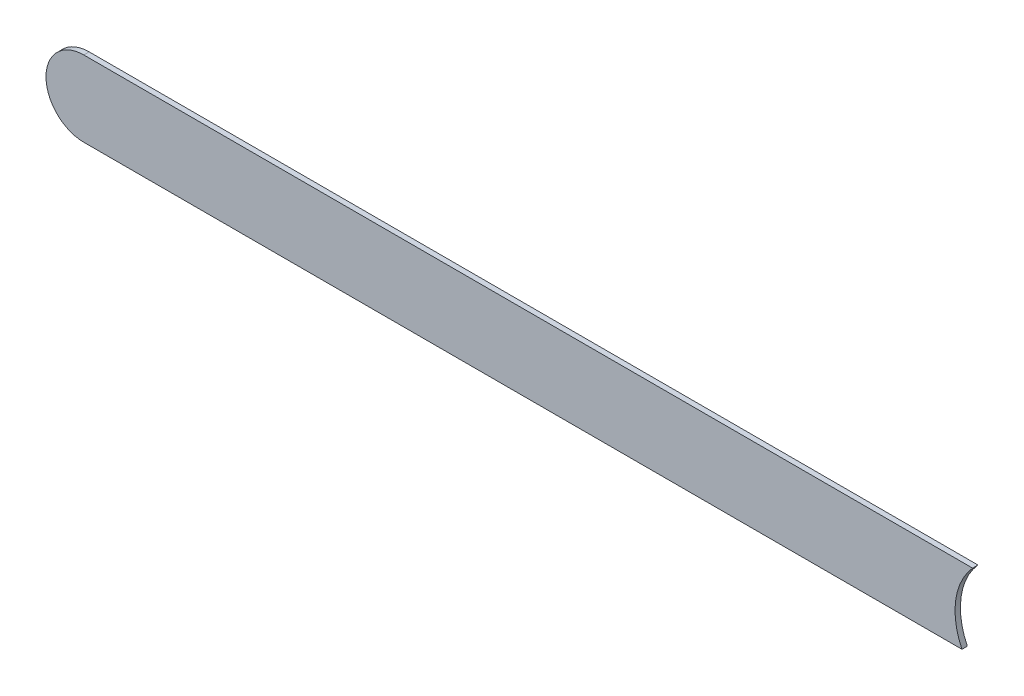
ISO-10303-21;
HEADER;
FILE_DESCRIPTION(('STEP AP214'),'2;1');
FILE_NAME('part.step','',(''),(''),'','','');
FILE_SCHEMA(('AUTOMOTIVE_DESIGN { 1 0 10303 214 1 1 1 1 }'));
ENDSEC;
DATA;
#1=APPLICATION_CONTEXT('core data for automotive mechanical design processes');
#2=APPLICATION_PROTOCOL_DEFINITION('international standard','automotive_design',2000,#1);
#3=PRODUCT_CONTEXT('',#1,'mechanical');
#4=PRODUCT('Part','Part','',(#3));
#5=PRODUCT_RELATED_PRODUCT_CATEGORY('part','',(#4));
#6=PRODUCT_DEFINITION_FORMATION('','',#4);
#7=PRODUCT_DEFINITION_CONTEXT('part definition',#1,'design');
#8=PRODUCT_DEFINITION('design','',#6,#7);
#9=PRODUCT_DEFINITION_SHAPE('','',#8);
#10=(LENGTH_UNIT() NAMED_UNIT(*) SI_UNIT(.MILLI.,.METRE.));
#11=(NAMED_UNIT(*) PLANE_ANGLE_UNIT() SI_UNIT($,.RADIAN.));
#12=(NAMED_UNIT(*) SI_UNIT($,.STERADIAN.) SOLID_ANGLE_UNIT());
#13=UNCERTAINTY_MEASURE_WITH_UNIT(LENGTH_MEASURE(1.E-05),#10,'distance_accuracy_value','');
#14=(GEOMETRIC_REPRESENTATION_CONTEXT(3) GLOBAL_UNCERTAINTY_ASSIGNED_CONTEXT((#13)) GLOBAL_UNIT_ASSIGNED_CONTEXT((#10,
#11,#12)) REPRESENTATION_CONTEXT('',''));
#15=CARTESIAN_POINT('',(0.,0.,0.));
#16=DIRECTION('',(0.,0.,1.));
#17=DIRECTION('',(1.,0.,0.));
#18=AXIS2_PLACEMENT_3D('',#15,#16,#17);
#19=CARTESIAN_POINT('',(41.90000002,111.75000002,0.));
#20=DIRECTION('',(0.,1.,0.));
#21=DIRECTION('',(1.,0.,0.));
#22=AXIS2_PLACEMENT_3D('',#19,#20,#21);
#23=PLANE('',#22);
#24=DIRECTION('',(1.,0.,0.));
#25=VECTOR('',#24,1.);
#26=CARTESIAN_POINT('',(41.90000002,111.75000002,0.03556));
#27=LINE('',#26,#25);
#28=CARTESIAN_POINT('',(41.90000002,111.75000002,0.03556));
#29=VERTEX_POINT('',#28);
#30=CARTESIAN_POINT('',(47.7069108866228,111.75000002,0.03556));
#31=VERTEX_POINT('',#30);
#32=EDGE_CURVE('E11',#29,#31,#27,.T.);
#33=ORIENTED_EDGE('',*,*,#32,.F.);
#34=DIRECTION('',(0.,0.,1.));
#35=VECTOR('',#34,1.);
#36=CARTESIAN_POINT('',(41.90000002,111.75000002,0.));
#37=LINE('',#36,#35);
#38=CARTESIAN_POINT('',(41.90000002,111.75000002,0.));
#39=VERTEX_POINT('',#38);
#40=EDGE_CURVE('E24',#39,#29,#37,.T.);
#41=ORIENTED_EDGE('',*,*,#40,.F.);
#42=DIRECTION('',(1.,0.,0.));
#43=VECTOR('',#42,1.);
#44=CARTESIAN_POINT('',(41.90000002,111.75000002,0.));
#45=LINE('',#44,#43);
#46=CARTESIAN_POINT('',(47.7069108866228,111.75000002,0.));
#47=VERTEX_POINT('',#46);
#48=EDGE_CURVE('E75',#39,#47,#45,.T.);
#49=ORIENTED_EDGE('',*,*,#48,.T.);
#50=DIRECTION('',(0.,0.,1.));
#51=VECTOR('',#50,1.);
#52=CARTESIAN_POINT('',(47.7069108866228,111.75000002,0.));
#53=LINE('',#52,#51);
#54=EDGE_CURVE('E37',#47,#31,#53,.T.);
#55=ORIENTED_EDGE('',*,*,#54,.T.);
#56=EDGE_LOOP('',(#33,#41,#49,#55));
#57=FACE_BOUND('',#56,.T.);
#58=ADVANCED_FACE('F17',(#57),#23,.F.);
#59=CARTESIAN_POINT('',(48.1110036,111.9480108,0.));
#60=DIRECTION('',(0.,0.,-1.));
#61=DIRECTION('',(1.,0.,0.));
#62=AXIS2_PLACEMENT_3D('',#59,#60,#61);
#63=CYLINDRICAL_SURFACE('',#62,0.4499991);
#64=DIRECTION('',(0.,0.,1.));
#65=VECTOR('',#64,1.);
#66=CARTESIAN_POINT('',(47.7773835991277,112.24999902,0.));
#67=LINE('',#66,#65);
#68=CARTESIAN_POINT('',(47.7773835991277,112.24999902,0.));
#69=VERTEX_POINT('',#68);
#70=CARTESIAN_POINT('',(47.7773835991277,112.24999902,0.03556));
#71=VERTEX_POINT('',#70);
#72=EDGE_CURVE('E67',#69,#71,#67,.T.);
#73=ORIENTED_EDGE('',*,*,#72,.T.);
#74=CARTESIAN_POINT('',(48.1110036,111.9480108,0.03556));
#75=DIRECTION('',(0.,0.,1.));
#76=DIRECTION('',(1.,0.,0.));
#77=AXIS2_PLACEMENT_3D('',#74,#75,#76);
#78=CIRCLE('',#77,0.4499991);
#79=EDGE_CURVE('E82',#71,#31,#78,.T.);
#80=ORIENTED_EDGE('',*,*,#79,.T.);
#81=ORIENTED_EDGE('',*,*,#54,.F.);
#82=CARTESIAN_POINT('',(48.1110036,111.9480108,0.));
#83=DIRECTION('',(0.,0.,1.));
#84=DIRECTION('',(1.,0.,0.));
#85=AXIS2_PLACEMENT_3D('',#82,#83,#84);
#86=CIRCLE('',#85,0.4499991);
#87=EDGE_CURVE('E80',#69,#47,#86,.T.);
#88=ORIENTED_EDGE('',*,*,#87,.F.);
#89=EDGE_LOOP('',(#73,#80,#81,#88));
#90=FACE_BOUND('',#89,.T.);
#91=ADVANCED_FACE('F88',(#90),#63,.F.);
#92=CARTESIAN_POINT('',(47.7773835991277,112.24999902,0.));
#93=DIRECTION('',(0.,-1.,0.));
#94=DIRECTION('',(-1.,0.,0.));
#95=AXIS2_PLACEMENT_3D('',#92,#93,#94);
#96=PLANE('',#95);
#97=DIRECTION('',(-1.,0.,0.));
#98=VECTOR('',#97,1.);
#99=CARTESIAN_POINT('',(48.05901488,112.24999902,0.03556));
#100=LINE('',#99,#98);
#101=CARTESIAN_POINT('',(41.90000002,112.24999902,0.03556));
#102=VERTEX_POINT('',#101);
#103=EDGE_CURVE('E71',#71,#102,#100,.T.);
#104=ORIENTED_EDGE('',*,*,#103,.F.);
#105=ORIENTED_EDGE('',*,*,#72,.F.);
#106=DIRECTION('',(-1.,0.,0.));
#107=VECTOR('',#106,1.);
#108=CARTESIAN_POINT('',(48.05901488,112.24999902,0.));
#109=LINE('',#108,#107);
#110=CARTESIAN_POINT('',(41.90000002,112.24999902,0.));
#111=VERTEX_POINT('',#110);
#112=EDGE_CURVE('E63',#69,#111,#109,.T.);
#113=ORIENTED_EDGE('',*,*,#112,.T.);
#114=DIRECTION('',(0.,0.,1.));
#115=VECTOR('',#114,1.);
#116=CARTESIAN_POINT('',(41.90000002,112.24999902,0.));
#117=LINE('',#116,#115);
#118=EDGE_CURVE('E53',#111,#102,#117,.T.);
#119=ORIENTED_EDGE('',*,*,#118,.T.);
#120=EDGE_LOOP('',(#104,#105,#113,#119));
#121=FACE_BOUND('',#120,.T.);
#122=ADVANCED_FACE('F66',(#121),#96,.F.);
#123=CARTESIAN_POINT('',(41.90000002,111.99999952,0.));
#124=DIRECTION('',(0.,0.,-1.));
#125=DIRECTION('',(0.,1.,0.));
#126=AXIS2_PLACEMENT_3D('',#123,#124,#125);
#127=CYLINDRICAL_SURFACE('',#126,0.249999500000001);
#128=CARTESIAN_POINT('',(41.90000002,111.99999952,0.03556));
#129=DIRECTION('',(0.,0.,1.));
#130=DIRECTION('',(0.,1.,0.));
#131=AXIS2_PLACEMENT_3D('',#128,#129,#130);
#132=CIRCLE('',#131,0.249999500000001);
#133=EDGE_CURVE('E59',#102,#29,#132,.T.);
#134=ORIENTED_EDGE('',*,*,#133,.F.);
#135=ORIENTED_EDGE('',*,*,#118,.F.);
#136=CARTESIAN_POINT('',(41.90000002,111.99999952,0.));
#137=DIRECTION('',(0.,0.,1.));
#138=DIRECTION('',(0.,1.,0.));
#139=AXIS2_PLACEMENT_3D('',#136,#137,#138);
#140=CIRCLE('',#139,0.249999500000001);
#141=EDGE_CURVE('E57',#111,#39,#140,.T.);
#142=ORIENTED_EDGE('',*,*,#141,.T.);
#143=ORIENTED_EDGE('',*,*,#40,.T.);
#144=EDGE_LOOP('',(#134,#135,#142,#143));
#145=FACE_BOUND('',#144,.T.);
#146=ADVANCED_FACE('F55',(#145),#127,.T.);
#147=CARTESIAN_POINT('',(41.90000002,111.75000002,0.));
#148=DIRECTION('',(0.,0.,-1.));
#149=DIRECTION('',(-1.,0.,0.));
#150=AXIS2_PLACEMENT_3D('',#147,#148,#149);
#151=PLANE('',#150);
#152=ORIENTED_EDGE('',*,*,#48,.F.);
#153=ORIENTED_EDGE('',*,*,#141,.F.);
#154=ORIENTED_EDGE('',*,*,#112,.F.);
#155=ORIENTED_EDGE('',*,*,#87,.T.);
#156=EDGE_LOOP('',(#152,#153,#154,#155));
#157=FACE_BOUND('',#156,.T.);
#158=ADVANCED_FACE('F74',(#157),#151,.T.);
#159=CARTESIAN_POINT('',(41.90000002,111.75000002,0.03556));
#160=DIRECTION('',(0.,0.,-1.));
#161=DIRECTION('',(-1.,0.,0.));
#162=AXIS2_PLACEMENT_3D('',#159,#160,#161);
#163=PLANE('',#162);
#164=ORIENTED_EDGE('',*,*,#133,.T.);
#165=ORIENTED_EDGE('',*,*,#32,.T.);
#166=ORIENTED_EDGE('',*,*,#79,.F.);
#167=ORIENTED_EDGE('',*,*,#103,.T.);
#168=EDGE_LOOP('',(#164,#165,#166,#167));
#169=FACE_BOUND('',#168,.T.);
#170=ADVANCED_FACE('F91',(#169),#163,.F.);
#171=CLOSED_SHELL('',(#58,#91,#122,#146,#158,#170));
#172=MANIFOLD_SOLID_BREP('B1',#171);
#173=ADVANCED_BREP_SHAPE_REPRESENTATION('',(#18,#172),#14);
#174=SHAPE_DEFINITION_REPRESENTATION(#9,#173);
ENDSEC;
END-ISO-10303-21;
